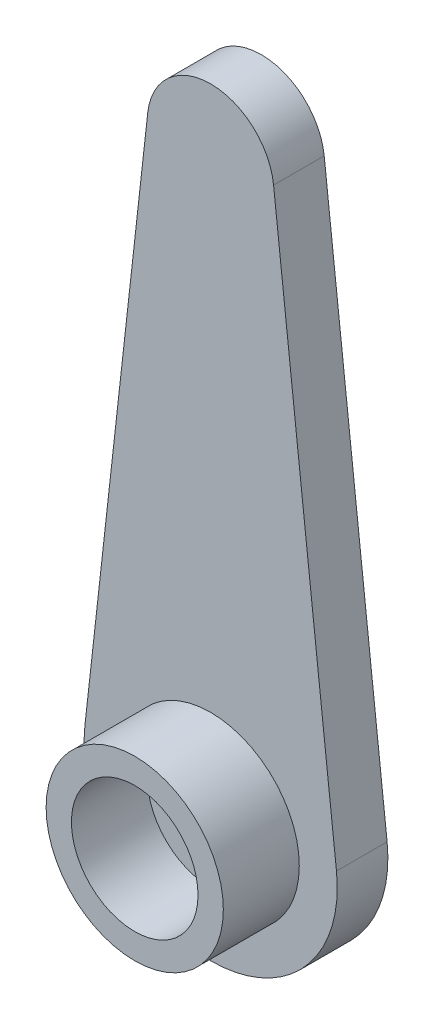
ISO-10303-21;
HEADER;
FILE_DESCRIPTION(('STEP AP214'),'2;1');
FILE_NAME('part.step','',(''),(''),'','','');
FILE_SCHEMA(('AUTOMOTIVE_DESIGN { 1 0 10303 214 1 1 1 1 }'));
ENDSEC;
DATA;
#1=APPLICATION_CONTEXT('core data for automotive mechanical design processes');
#2=APPLICATION_PROTOCOL_DEFINITION('international standard','automotive_design',2000,#1);
#3=PRODUCT_CONTEXT('',#1,'mechanical');
#4=PRODUCT('Part','Part','',(#3));
#5=PRODUCT_RELATED_PRODUCT_CATEGORY('part','',(#4));
#6=PRODUCT_DEFINITION_FORMATION('','',#4);
#7=PRODUCT_DEFINITION_CONTEXT('part definition',#1,'design');
#8=PRODUCT_DEFINITION('design','',#6,#7);
#9=PRODUCT_DEFINITION_SHAPE('','',#8);
#10=(LENGTH_UNIT() NAMED_UNIT(*) SI_UNIT(.MILLI.,.METRE.));
#11=(NAMED_UNIT(*) PLANE_ANGLE_UNIT() SI_UNIT($,.RADIAN.));
#12=(NAMED_UNIT(*) SI_UNIT($,.STERADIAN.) SOLID_ANGLE_UNIT());
#13=UNCERTAINTY_MEASURE_WITH_UNIT(LENGTH_MEASURE(1.E-05),#10,'distance_accuracy_value','');
#14=(GEOMETRIC_REPRESENTATION_CONTEXT(3) GLOBAL_UNCERTAINTY_ASSIGNED_CONTEXT((#13)) GLOBAL_UNIT_ASSIGNED_CONTEXT((#10,
#11,#12)) REPRESENTATION_CONTEXT('',''));
#15=CARTESIAN_POINT('',(0.,0.,0.));
#16=DIRECTION('',(0.,0.,1.));
#17=DIRECTION('',(1.,0.,0.));
#18=AXIS2_PLACEMENT_3D('',#15,#16,#17);
#19=CARTESIAN_POINT('',(0.,0.,2.));
#20=DIRECTION('',(0.,0.,-1.));
#21=DIRECTION('',(-1.,0.,0.));
#22=AXIS2_PLACEMENT_3D('',#19,#20,#21);
#23=CYLINDRICAL_SURFACE('',#22,5.);
#24=CARTESIAN_POINT('',(0.,0.,0.));
#25=DIRECTION('',(0.,0.,1.));
#26=DIRECTION('',(1.,0.,0.));
#27=AXIS2_PLACEMENT_3D('',#24,#25,#26);
#28=CIRCLE('',#27,5.);
#29=CARTESIAN_POINT('',(-4.96903994999953,0.555555555555555,0.));
#30=VERTEX_POINT('',#29);
#31=CARTESIAN_POINT('',(4.96903994999953,0.555555555555569,0.));
#32=VERTEX_POINT('',#31);
#33=EDGE_CURVE('E101',#30,#32,#28,.T.);
#34=ORIENTED_EDGE('',*,*,#33,.T.);
#35=DIRECTION('',(0.,0.,-1.));
#36=VECTOR('',#35,1.);
#37=CARTESIAN_POINT('',(4.96903994999953,0.555555555555569,2.));
#38=LINE('',#37,#36);
#39=CARTESIAN_POINT('',(4.96903994999953,0.555555555555569,2.));
#40=VERTEX_POINT('',#39);
#41=EDGE_CURVE('E43',#40,#32,#38,.T.);
#42=ORIENTED_EDGE('',*,*,#41,.F.);
#43=CARTESIAN_POINT('',(0.,0.,2.));
#44=DIRECTION('',(0.,0.,1.));
#45=DIRECTION('',(1.,0.,0.));
#46=AXIS2_PLACEMENT_3D('',#43,#44,#45);
#47=CIRCLE('',#46,5.);
#48=CARTESIAN_POINT('',(-4.96903994999953,0.555555555555555,2.));
#49=VERTEX_POINT('',#48);
#50=EDGE_CURVE('E87',#49,#40,#47,.T.);
#51=ORIENTED_EDGE('',*,*,#50,.F.);
#52=DIRECTION('',(0.,0.,-1.));
#53=VECTOR('',#52,1.);
#54=CARTESIAN_POINT('',(-4.96903994999953,0.555555555555555,2.));
#55=LINE('',#54,#53);
#56=EDGE_CURVE('E97',#49,#30,#55,.T.);
#57=ORIENTED_EDGE('',*,*,#56,.T.);
#58=EDGE_LOOP('',(#34,#42,#51,#57));
#59=FACE_BOUND('',#58,.T.);
#60=ADVANCED_FACE('F35',(#59),#23,.T.);
#61=CARTESIAN_POINT('',(4.96903994999953,0.555555555555569,2.));
#62=DIRECTION('',(-0.993807989999906,-0.111111111111111,0.));
#63=DIRECTION('',(0.111111111111111,-0.993807989999906,0.));
#64=AXIS2_PLACEMENT_3D('',#61,#62,#63);
#65=PLANE('',#64);
#66=DIRECTION('',(-0.111111111111111,0.993807989999907,0.));
#67=VECTOR('',#66,1.);
#68=CARTESIAN_POINT('',(4.96903994999953,0.555555555555569,0.));
#69=LINE('',#68,#67);
#70=CARTESIAN_POINT('',(2.48451997499977,22.7777777777778,0.));
#71=VERTEX_POINT('',#70);
#72=EDGE_CURVE('E92',#32,#71,#69,.T.);
#73=ORIENTED_EDGE('',*,*,#72,.T.);
#74=DIRECTION('',(0.,0.,-1.));
#75=VECTOR('',#74,1.);
#76=CARTESIAN_POINT('',(2.48451997499977,22.7777777777778,2.));
#77=LINE('',#76,#75);
#78=CARTESIAN_POINT('',(2.48451997499977,22.7777777777778,2.));
#79=VERTEX_POINT('',#78);
#80=EDGE_CURVE('E90',#79,#71,#77,.T.);
#81=ORIENTED_EDGE('',*,*,#80,.F.);
#82=DIRECTION('',(-0.111111111111111,0.993807989999907,0.));
#83=VECTOR('',#82,1.);
#84=CARTESIAN_POINT('',(4.96903994999953,0.555555555555569,2.));
#85=LINE('',#84,#83);
#86=EDGE_CURVE('E82',#40,#79,#85,.T.);
#87=ORIENTED_EDGE('',*,*,#86,.F.);
#88=ORIENTED_EDGE('',*,*,#41,.T.);
#89=EDGE_LOOP('',(#73,#81,#87,#88));
#90=FACE_BOUND('',#89,.T.);
#91=ADVANCED_FACE('F91',(#90),#65,.F.);
#92=CARTESIAN_POINT('',(0.,22.5,2.));
#93=DIRECTION('',(0.,0.,-1.));
#94=DIRECTION('',(-1.,0.,0.));
#95=AXIS2_PLACEMENT_3D('',#92,#93,#94);
#96=CYLINDRICAL_SURFACE('',#95,2.5);
#97=CARTESIAN_POINT('',(0.,22.5,0.));
#98=DIRECTION('',(0.,0.,1.));
#99=DIRECTION('',(1.,0.,0.));
#100=AXIS2_PLACEMENT_3D('',#97,#98,#99);
#101=CIRCLE('',#100,2.5);
#102=CARTESIAN_POINT('',(-2.48451997499977,22.7777777777778,0.));
#103=VERTEX_POINT('',#102);
#104=EDGE_CURVE('E68',#71,#103,#101,.T.);
#105=ORIENTED_EDGE('',*,*,#104,.T.);
#106=DIRECTION('',(0.,0.,-1.));
#107=VECTOR('',#106,1.);
#108=CARTESIAN_POINT('',(-2.48451997499977,22.7777777777778,2.));
#109=LINE('',#108,#107);
#110=CARTESIAN_POINT('',(-2.48451997499977,22.7777777777778,2.));
#111=VERTEX_POINT('',#110);
#112=EDGE_CURVE('E93',#111,#103,#109,.T.);
#113=ORIENTED_EDGE('',*,*,#112,.F.);
#114=CARTESIAN_POINT('',(0.,22.5,2.));
#115=DIRECTION('',(0.,0.,1.));
#116=DIRECTION('',(1.,0.,0.));
#117=AXIS2_PLACEMENT_3D('',#114,#115,#116);
#118=CIRCLE('',#117,2.5);
#119=EDGE_CURVE('E85',#79,#111,#118,.T.);
#120=ORIENTED_EDGE('',*,*,#119,.F.);
#121=ORIENTED_EDGE('',*,*,#80,.T.);
#122=EDGE_LOOP('',(#105,#113,#120,#121));
#123=FACE_BOUND('',#122,.T.);
#124=ADVANCED_FACE('F95',(#123),#96,.T.);
#125=CARTESIAN_POINT('',(-4.96903994999953,0.555555555555555,2.));
#126=DIRECTION('',(0.993807989999907,-0.111111111111111,0.));
#127=DIRECTION('',(0.111111111111111,0.993807989999906,0.));
#128=AXIS2_PLACEMENT_3D('',#125,#126,#127);
#129=PLANE('',#128);
#130=DIRECTION('',(-0.111111111111111,-0.993807989999907,0.));
#131=VECTOR('',#130,1.);
#132=CARTESIAN_POINT('',(-4.96903994999953,0.555555555555555,0.));
#133=LINE('',#132,#131);
#134=EDGE_CURVE('E74',#103,#30,#133,.T.);
#135=ORIENTED_EDGE('',*,*,#134,.T.);
#136=ORIENTED_EDGE('',*,*,#56,.F.);
#137=DIRECTION('',(-0.111111111111111,-0.993807989999907,0.));
#138=VECTOR('',#137,1.);
#139=CARTESIAN_POINT('',(-4.96903994999953,0.555555555555555,2.));
#140=LINE('',#139,#138);
#141=EDGE_CURVE('E51',#111,#49,#140,.T.);
#142=ORIENTED_EDGE('',*,*,#141,.F.);
#143=ORIENTED_EDGE('',*,*,#112,.T.);
#144=EDGE_LOOP('',(#135,#136,#142,#143));
#145=FACE_BOUND('',#144,.T.);
#146=ADVANCED_FACE('F123',(#145),#129,.F.);
#147=CARTESIAN_POINT('',(0.,0.,2.));
#148=DIRECTION('',(0.,0.,1.));
#149=DIRECTION('',(1.,0.,0.));
#150=AXIS2_PLACEMENT_3D('',#147,#148,#149);
#151=PLANE('',#150);
#152=CARTESIAN_POINT('',(0.,0.,2.));
#153=DIRECTION('',(0.,0.,1.));
#154=DIRECTION('',(1.,0.,0.));
#155=AXIS2_PLACEMENT_3D('',#152,#153,#154);
#156=CIRCLE('',#155,3.5);
#157=CARTESIAN_POINT('',(3.5,0.,2.));
#158=VERTEX_POINT('',#157);
#159=EDGE_CURVE('E192',#158,#158,#156,.T.);
#160=ORIENTED_EDGE('',*,*,#159,.F.);
#161=EDGE_LOOP('',(#160));
#162=FACE_BOUND('',#161,.T.);
#163=ORIENTED_EDGE('',*,*,#50,.T.);
#164=ORIENTED_EDGE('',*,*,#86,.T.);
#165=ORIENTED_EDGE('',*,*,#119,.T.);
#166=ORIENTED_EDGE('',*,*,#141,.T.);
#167=EDGE_LOOP('',(#163,#164,#165,#166));
#168=FACE_BOUND('',#167,.T.);
#169=ADVANCED_FACE('F83',(#162,#168),#151,.T.);
#170=CARTESIAN_POINT('',(0.,0.,0.));
#171=DIRECTION('',(0.,0.,1.));
#172=DIRECTION('',(1.,0.,0.));
#173=AXIS2_PLACEMENT_3D('',#170,#171,#172);
#174=PLANE('',#173);
#175=ORIENTED_EDGE('',*,*,#33,.F.);
#176=ORIENTED_EDGE('',*,*,#134,.F.);
#177=ORIENTED_EDGE('',*,*,#104,.F.);
#178=ORIENTED_EDGE('',*,*,#72,.F.);
#179=EDGE_LOOP('',(#175,#176,#177,#178));
#180=FACE_BOUND('',#179,.T.);
#181=ADVANCED_FACE('F112',(#180),#174,.F.);
#182=CARTESIAN_POINT('',(0.,0.,5.));
#183=DIRECTION('',(0.,0.,1.));
#184=DIRECTION('',(1.,0.,0.));
#185=AXIS2_PLACEMENT_3D('',#182,#183,#184);
#186=PLANE('',#185);
#187=CARTESIAN_POINT('',(0.,0.,5.));
#188=DIRECTION('',(0.,0.,1.));
#189=DIRECTION('',(1.,0.,0.));
#190=AXIS2_PLACEMENT_3D('',#187,#188,#189);
#191=CIRCLE('',#190,3.5);
#192=CARTESIAN_POINT('',(3.5,0.,5.));
#193=VERTEX_POINT('',#192);
#194=EDGE_CURVE('E104',#193,#193,#191,.T.);
#195=ORIENTED_EDGE('',*,*,#194,.T.);
#196=EDGE_LOOP('',(#195));
#197=FACE_BOUND('',#196,.T.);
#198=CARTESIAN_POINT('',(0.,0.,5.));
#199=DIRECTION('',(0.,0.,1.));
#200=DIRECTION('',(1.,0.,0.));
#201=AXIS2_PLACEMENT_3D('',#198,#199,#200);
#202=CIRCLE('',#201,2.5);
#203=CARTESIAN_POINT('',(2.5,0.,5.));
#204=VERTEX_POINT('',#203);
#205=EDGE_CURVE('E190',#204,#204,#202,.T.);
#206=ORIENTED_EDGE('',*,*,#205,.F.);
#207=EDGE_LOOP('',(#206));
#208=FACE_BOUND('',#207,.T.);
#209=ADVANCED_FACE('F114',(#197,#208),#186,.T.);
#210=CARTESIAN_POINT('',(0.,0.,5.));
#211=DIRECTION('',(0.,0.,-1.));
#212=DIRECTION('',(-1.,0.,0.));
#213=AXIS2_PLACEMENT_3D('',#210,#211,#212);
#214=CYLINDRICAL_SURFACE('',#213,3.5);
#215=ORIENTED_EDGE('',*,*,#194,.F.);
#216=EDGE_LOOP('',(#215));
#217=FACE_BOUND('',#216,.T.);
#218=ORIENTED_EDGE('',*,*,#159,.T.);
#219=EDGE_LOOP('',(#218));
#220=FACE_BOUND('',#219,.T.);
#221=ADVANCED_FACE('F120',(#217,#220),#214,.T.);
#222=CARTESIAN_POINT('',(0.,0.,5.));
#223=DIRECTION('',(0.,0.,-1.));
#224=DIRECTION('',(-1.,0.,0.));
#225=AXIS2_PLACEMENT_3D('',#222,#223,#224);
#226=CYLINDRICAL_SURFACE('',#225,2.5);
#227=ORIENTED_EDGE('',*,*,#205,.T.);
#228=EDGE_LOOP('',(#227));
#229=FACE_BOUND('',#228,.T.);
#230=CARTESIAN_POINT('',(0.,0.,2.));
#231=DIRECTION('',(0.,0.,1.));
#232=DIRECTION('',(1.,0.,0.));
#233=AXIS2_PLACEMENT_3D('',#230,#231,#232);
#234=CIRCLE('',#233,2.5);
#235=CARTESIAN_POINT('',(2.5,0.,2.));
#236=VERTEX_POINT('',#235);
#237=EDGE_CURVE('E11',#236,#236,#234,.F.);
#238=ORIENTED_EDGE('',*,*,#237,.T.);
#239=EDGE_LOOP('',(#238));
#240=FACE_BOUND('',#239,.T.);
#241=ADVANCED_FACE('F163',(#229,#240),#226,.F.);
#242=ORIENTED_EDGE('',*,*,#237,.F.);
#243=EDGE_LOOP('',(#242));
#244=FACE_BOUND('',#243,.T.);
#245=ADVANCED_FACE('F126',(#244),#151,.T.);
#246=CLOSED_SHELL('',(#60,#91,#124,#146,#169,#181,#209,#221,#241,#245));
#247=MANIFOLD_SOLID_BREP('B2',#246);
#248=ADVANCED_BREP_SHAPE_REPRESENTATION('',(#18,#247),#14);
#249=SHAPE_DEFINITION_REPRESENTATION(#9,#248);
ENDSEC;
END-ISO-10303-21;
